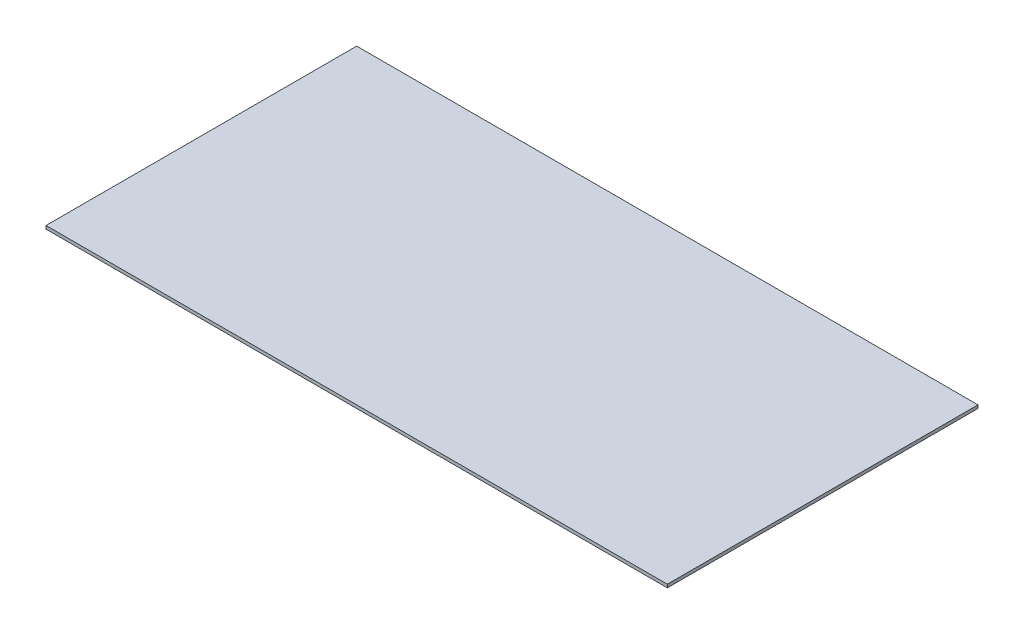
ISO-10303-21;
HEADER;
FILE_DESCRIPTION(('STEP AP214'),'2;1');
FILE_NAME('part.step','',(''),(''),'','','');
FILE_SCHEMA(('AUTOMOTIVE_DESIGN { 1 0 10303 214 1 1 1 1 }'));
ENDSEC;
DATA;
#1=APPLICATION_CONTEXT('core data for automotive mechanical design processes');
#2=APPLICATION_PROTOCOL_DEFINITION('international standard','automotive_design',2000,#1);
#3=PRODUCT_CONTEXT('',#1,'mechanical');
#4=PRODUCT('Part','Part','',(#3));
#5=PRODUCT_RELATED_PRODUCT_CATEGORY('part','',(#4));
#6=PRODUCT_DEFINITION_FORMATION('','',#4);
#7=PRODUCT_DEFINITION_CONTEXT('part definition',#1,'design');
#8=PRODUCT_DEFINITION('design','',#6,#7);
#9=PRODUCT_DEFINITION_SHAPE('','',#8);
#10=(LENGTH_UNIT() NAMED_UNIT(*) SI_UNIT(.MILLI.,.METRE.));
#11=(NAMED_UNIT(*) PLANE_ANGLE_UNIT() SI_UNIT($,.RADIAN.));
#12=(NAMED_UNIT(*) SI_UNIT($,.STERADIAN.) SOLID_ANGLE_UNIT());
#13=UNCERTAINTY_MEASURE_WITH_UNIT(LENGTH_MEASURE(1.E-05),#10,'distance_accuracy_value','');
#14=(GEOMETRIC_REPRESENTATION_CONTEXT(3) GLOBAL_UNCERTAINTY_ASSIGNED_CONTEXT((#13)) GLOBAL_UNIT_ASSIGNED_CONTEXT((#10,
#11,#12)) REPRESENTATION_CONTEXT('',''));
#15=CARTESIAN_POINT('',(0.,0.,0.));
#16=DIRECTION('',(0.,0.,1.));
#17=DIRECTION('',(1.,0.,0.));
#18=AXIS2_PLACEMENT_3D('',#15,#16,#17);
#19=CARTESIAN_POINT('',(0.,0.13,0.));
#20=DIRECTION('',(1.,0.,0.));
#21=DIRECTION('',(0.,0.,-1.));
#22=AXIS2_PLACEMENT_3D('',#19,#20,#21);
#23=PLANE('',#22);
#24=DIRECTION('',(0.,0.,1.));
#25=VECTOR('',#24,1.);
#26=CARTESIAN_POINT('',(0.,0.,0.));
#27=LINE('',#26,#25);
#28=CARTESIAN_POINT('',(0.,0.,0.));
#29=VERTEX_POINT('',#28);
#30=CARTESIAN_POINT('',(0.,0.,12.7));
#31=VERTEX_POINT('',#30);
#32=EDGE_CURVE('E98',#29,#31,#27,.T.);
#33=ORIENTED_EDGE('',*,*,#32,.T.);
#34=DIRECTION('',(0.,-1.,0.));
#35=VECTOR('',#34,1.);
#36=CARTESIAN_POINT('',(0.,0.13,12.7));
#37=LINE('',#36,#35);
#38=CARTESIAN_POINT('',(0.,0.13,12.7));
#39=VERTEX_POINT('',#38);
#40=EDGE_CURVE('E11',#39,#31,#37,.T.);
#41=ORIENTED_EDGE('',*,*,#40,.F.);
#42=DIRECTION('',(0.,0.,1.));
#43=VECTOR('',#42,1.);
#44=CARTESIAN_POINT('',(0.,0.13,0.));
#45=LINE('',#44,#43);
#46=CARTESIAN_POINT('',(0.,0.13,0.));
#47=VERTEX_POINT('',#46);
#48=EDGE_CURVE('E86',#47,#39,#45,.T.);
#49=ORIENTED_EDGE('',*,*,#48,.F.);
#50=DIRECTION('',(0.,-1.,0.));
#51=VECTOR('',#50,1.);
#52=CARTESIAN_POINT('',(0.,0.13,0.));
#53=LINE('',#52,#51);
#54=EDGE_CURVE('E94',#47,#29,#53,.T.);
#55=ORIENTED_EDGE('',*,*,#54,.T.);
#56=EDGE_LOOP('',(#33,#41,#49,#55));
#57=FACE_BOUND('',#56,.T.);
#58=ADVANCED_FACE('F35',(#57),#23,.F.);
#59=CARTESIAN_POINT('',(0.,0.13,12.7));
#60=DIRECTION('',(0.,0.,-1.));
#61=DIRECTION('',(-1.,0.,0.));
#62=AXIS2_PLACEMENT_3D('',#59,#60,#61);
#63=PLANE('',#62);
#64=DIRECTION('',(1.,0.,0.));
#65=VECTOR('',#64,1.);
#66=CARTESIAN_POINT('',(0.,0.,12.7));
#67=LINE('',#66,#65);
#68=CARTESIAN_POINT('',(25.4,0.,12.7));
#69=VERTEX_POINT('',#68);
#70=EDGE_CURVE('E90',#31,#69,#67,.T.);
#71=ORIENTED_EDGE('',*,*,#70,.T.);
#72=DIRECTION('',(0.,-1.,0.));
#73=VECTOR('',#72,1.);
#74=CARTESIAN_POINT('',(25.4,0.13,12.7));
#75=LINE('',#74,#73);
#76=CARTESIAN_POINT('',(25.4,0.13,12.7));
#77=VERTEX_POINT('',#76);
#78=EDGE_CURVE('E43',#77,#69,#75,.T.);
#79=ORIENTED_EDGE('',*,*,#78,.F.);
#80=DIRECTION('',(1.,0.,0.));
#81=VECTOR('',#80,1.);
#82=CARTESIAN_POINT('',(0.,0.13,12.7));
#83=LINE('',#82,#81);
#84=EDGE_CURVE('E81',#39,#77,#83,.T.);
#85=ORIENTED_EDGE('',*,*,#84,.F.);
#86=ORIENTED_EDGE('',*,*,#40,.T.);
#87=EDGE_LOOP('',(#71,#79,#85,#86));
#88=FACE_BOUND('',#87,.T.);
#89=ADVANCED_FACE('F89',(#88),#63,.F.);
#90=CARTESIAN_POINT('',(25.4,0.13,0.));
#91=DIRECTION('',(-1.,0.,0.));
#92=DIRECTION('',(0.,0.,1.));
#93=AXIS2_PLACEMENT_3D('',#90,#91,#92);
#94=PLANE('',#93);
#95=DIRECTION('',(0.,0.,-1.));
#96=VECTOR('',#95,1.);
#97=CARTESIAN_POINT('',(25.4,0.,0.));
#98=LINE('',#97,#96);
#99=CARTESIAN_POINT('',(25.4,0.,0.));
#100=VERTEX_POINT('',#99);
#101=EDGE_CURVE('E68',#69,#100,#98,.T.);
#102=ORIENTED_EDGE('',*,*,#101,.T.);
#103=DIRECTION('',(0.,-1.,0.));
#104=VECTOR('',#103,1.);
#105=CARTESIAN_POINT('',(25.4,0.13,0.));
#106=LINE('',#105,#104);
#107=CARTESIAN_POINT('',(25.4,0.13,0.));
#108=VERTEX_POINT('',#107);
#109=EDGE_CURVE('E91',#108,#100,#106,.T.);
#110=ORIENTED_EDGE('',*,*,#109,.F.);
#111=DIRECTION('',(0.,0.,-1.));
#112=VECTOR('',#111,1.);
#113=CARTESIAN_POINT('',(25.4,0.13,0.));
#114=LINE('',#113,#112);
#115=EDGE_CURVE('E84',#77,#108,#114,.T.);
#116=ORIENTED_EDGE('',*,*,#115,.F.);
#117=ORIENTED_EDGE('',*,*,#78,.T.);
#118=EDGE_LOOP('',(#102,#110,#116,#117));
#119=FACE_BOUND('',#118,.T.);
#120=ADVANCED_FACE('F92',(#119),#94,.F.);
#121=CARTESIAN_POINT('',(0.,0.13,0.));
#122=DIRECTION('',(0.,0.,1.));
#123=DIRECTION('',(1.,0.,0.));
#124=AXIS2_PLACEMENT_3D('',#121,#122,#123);
#125=PLANE('',#124);
#126=DIRECTION('',(-1.,0.,0.));
#127=VECTOR('',#126,1.);
#128=CARTESIAN_POINT('',(0.,0.,0.));
#129=LINE('',#128,#127);
#130=EDGE_CURVE('E74',#100,#29,#129,.T.);
#131=ORIENTED_EDGE('',*,*,#130,.T.);
#132=ORIENTED_EDGE('',*,*,#54,.F.);
#133=DIRECTION('',(-1.,0.,0.));
#134=VECTOR('',#133,1.);
#135=CARTESIAN_POINT('',(0.,0.13,0.));
#136=LINE('',#135,#134);
#137=EDGE_CURVE('E51',#108,#47,#136,.T.);
#138=ORIENTED_EDGE('',*,*,#137,.F.);
#139=ORIENTED_EDGE('',*,*,#109,.T.);
#140=EDGE_LOOP('',(#131,#132,#138,#139));
#141=FACE_BOUND('',#140,.T.);
#142=ADVANCED_FACE('F105',(#141),#125,.F.);
#143=CARTESIAN_POINT('',(0.,0.13,0.));
#144=DIRECTION('',(0.,1.,0.));
#145=DIRECTION('',(0.,0.,1.));
#146=AXIS2_PLACEMENT_3D('',#143,#144,#145);
#147=PLANE('',#146);
#148=ORIENTED_EDGE('',*,*,#48,.T.);
#149=ORIENTED_EDGE('',*,*,#84,.T.);
#150=ORIENTED_EDGE('',*,*,#115,.T.);
#151=ORIENTED_EDGE('',*,*,#137,.T.);
#152=EDGE_LOOP('',(#148,#149,#150,#151));
#153=FACE_BOUND('',#152,.T.);
#154=ADVANCED_FACE('F82',(#153),#147,.T.);
#155=CARTESIAN_POINT('',(0.,0.,0.));
#156=DIRECTION('',(0.,1.,0.));
#157=DIRECTION('',(0.,0.,1.));
#158=AXIS2_PLACEMENT_3D('',#155,#156,#157);
#159=PLANE('',#158);
#160=ORIENTED_EDGE('',*,*,#32,.F.);
#161=ORIENTED_EDGE('',*,*,#130,.F.);
#162=ORIENTED_EDGE('',*,*,#101,.F.);
#163=ORIENTED_EDGE('',*,*,#70,.F.);
#164=EDGE_LOOP('',(#160,#161,#162,#163));
#165=FACE_BOUND('',#164,.T.);
#166=ADVANCED_FACE('F108',(#165),#159,.F.);
#167=CLOSED_SHELL('',(#58,#89,#120,#142,#154,#166));
#168=MANIFOLD_SOLID_BREP('B2',#167);
#169=ADVANCED_BREP_SHAPE_REPRESENTATION('',(#18,#168),#14);
#170=SHAPE_DEFINITION_REPRESENTATION(#9,#169);
ENDSEC;
END-ISO-10303-21;
